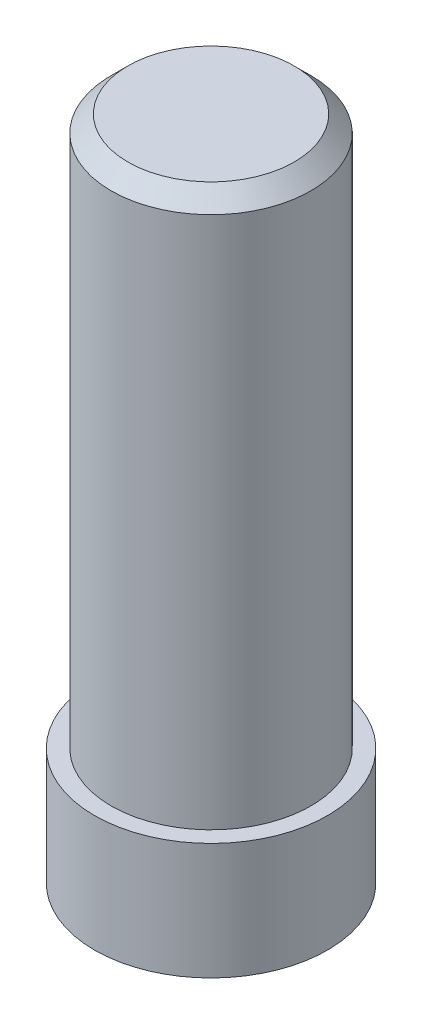
ISO-10303-21;
HEADER;
FILE_DESCRIPTION(('STEP AP214'),'2;1');
FILE_NAME('part.step','',(''),(''),'','','');
FILE_SCHEMA(('AUTOMOTIVE_DESIGN { 1 0 10303 214 1 1 1 1 }'));
ENDSEC;
DATA;
#1=APPLICATION_CONTEXT('core data for automotive mechanical design processes');
#2=APPLICATION_PROTOCOL_DEFINITION('international standard','automotive_design',2000,#1);
#3=PRODUCT_CONTEXT('',#1,'mechanical');
#4=PRODUCT('Part','Part','',(#3));
#5=PRODUCT_RELATED_PRODUCT_CATEGORY('part','',(#4));
#6=PRODUCT_DEFINITION_FORMATION('','',#4);
#7=PRODUCT_DEFINITION_CONTEXT('part definition',#1,'design');
#8=PRODUCT_DEFINITION('design','',#6,#7);
#9=PRODUCT_DEFINITION_SHAPE('','',#8);
#10=(LENGTH_UNIT() NAMED_UNIT(*) SI_UNIT(.MILLI.,.METRE.));
#11=(NAMED_UNIT(*) PLANE_ANGLE_UNIT() SI_UNIT($,.RADIAN.));
#12=(NAMED_UNIT(*) SI_UNIT($,.STERADIAN.) SOLID_ANGLE_UNIT());
#13=UNCERTAINTY_MEASURE_WITH_UNIT(LENGTH_MEASURE(1.E-05),#10,'distance_accuracy_value','');
#14=(GEOMETRIC_REPRESENTATION_CONTEXT(3) GLOBAL_UNCERTAINTY_ASSIGNED_CONTEXT((#13)) GLOBAL_UNIT_ASSIGNED_CONTEXT((#10,
#11,#12)) REPRESENTATION_CONTEXT('',''));
#15=CARTESIAN_POINT('',(0.,0.,0.));
#16=DIRECTION('',(0.,0.,1.));
#17=DIRECTION('',(1.,0.,0.));
#18=AXIS2_PLACEMENT_3D('',#15,#16,#17);
#19=CARTESIAN_POINT('',(0.,40.,0.));
#20=DIRECTION('',(0.,-1.,0.));
#21=DIRECTION('',(0.,0.,-1.));
#22=AXIS2_PLACEMENT_3D('',#19,#20,#21);
#23=CYLINDRICAL_SURFACE('',#22,6.);
#24=CARTESIAN_POINT('',(0.,7.,0.));
#25=DIRECTION('',(0.,1.,0.));
#26=DIRECTION('',(0.,0.,1.));
#27=AXIS2_PLACEMENT_3D('',#24,#25,#26);
#28=CIRCLE('',#27,6.);
#29=CARTESIAN_POINT('',(0.,7.,6.));
#30=VERTEX_POINT('',#29);
#31=EDGE_CURVE('E10',#30,#30,#28,.T.);
#32=ORIENTED_EDGE('',*,*,#31,.T.);
#33=EDGE_LOOP('',(#32));
#34=FACE_BOUND('',#33,.T.);
#35=CARTESIAN_POINT('',(0.,39.,0.));
#36=DIRECTION('',(0.,1.,0.));
#37=DIRECTION('',(0.,0.,1.));
#38=AXIS2_PLACEMENT_3D('',#35,#36,#37);
#39=CIRCLE('',#38,6.);
#40=CARTESIAN_POINT('',(0.,39.,6.));
#41=VERTEX_POINT('',#40);
#42=EDGE_CURVE('E53',#41,#41,#39,.T.);
#43=ORIENTED_EDGE('',*,*,#42,.F.);
#44=EDGE_LOOP('',(#43));
#45=FACE_BOUND('',#44,.T.);
#46=ADVANCED_FACE('F39',(#34,#45),#23,.T.);
#47=CARTESIAN_POINT('',(0.,7.,0.));
#48=DIRECTION('',(0.,-1.,0.));
#49=DIRECTION('',(0.,0.,-1.));
#50=AXIS2_PLACEMENT_3D('',#47,#48,#49);
#51=CYLINDRICAL_SURFACE('',#50,7.);
#52=CARTESIAN_POINT('',(0.,7.,0.));
#53=DIRECTION('',(0.,1.,0.));
#54=DIRECTION('',(0.,0.,1.));
#55=AXIS2_PLACEMENT_3D('',#52,#53,#54);
#56=CIRCLE('',#55,7.);
#57=CARTESIAN_POINT('',(0.,7.,7.));
#58=VERTEX_POINT('',#57);
#59=EDGE_CURVE('E47',#58,#58,#56,.T.);
#60=ORIENTED_EDGE('',*,*,#59,.F.);
#61=EDGE_LOOP('',(#60));
#62=FACE_BOUND('',#61,.T.);
#63=CARTESIAN_POINT('',(0.,0.,0.));
#64=DIRECTION('',(0.,1.,0.));
#65=DIRECTION('',(0.,0.,1.));
#66=AXIS2_PLACEMENT_3D('',#63,#64,#65);
#67=CIRCLE('',#66,7.);
#68=CARTESIAN_POINT('',(0.,0.,7.));
#69=VERTEX_POINT('',#68);
#70=EDGE_CURVE('E43',#69,#69,#67,.T.);
#71=ORIENTED_EDGE('',*,*,#70,.T.);
#72=EDGE_LOOP('',(#71));
#73=FACE_BOUND('',#72,.T.);
#74=ADVANCED_FACE('F41',(#62,#73),#51,.T.);
#75=CARTESIAN_POINT('',(0.,7.,0.));
#76=DIRECTION('',(0.,1.,0.));
#77=DIRECTION('',(0.,0.,1.));
#78=AXIS2_PLACEMENT_3D('',#75,#76,#77);
#79=PLANE('',#78);
#80=ORIENTED_EDGE('',*,*,#31,.F.);
#81=EDGE_LOOP('',(#80));
#82=FACE_BOUND('',#81,.T.);
#83=ORIENTED_EDGE('',*,*,#59,.T.);
#84=EDGE_LOOP('',(#83));
#85=FACE_BOUND('',#84,.T.);
#86=ADVANCED_FACE('F72',(#82,#85),#79,.T.);
#87=CARTESIAN_POINT('',(0.,0.,0.));
#88=DIRECTION('',(0.,1.,0.));
#89=DIRECTION('',(0.,0.,1.));
#90=AXIS2_PLACEMENT_3D('',#87,#88,#89);
#91=PLANE('',#90);
#92=ORIENTED_EDGE('',*,*,#70,.F.);
#93=EDGE_LOOP('',(#92));
#94=FACE_BOUND('',#93,.T.);
#95=ADVANCED_FACE('F64',(#94),#91,.F.);
#96=CARTESIAN_POINT('',(0.,40.,0.));
#97=DIRECTION('',(0.,-1.,0.));
#98=DIRECTION('',(0.,0.,-1.));
#99=AXIS2_PLACEMENT_3D('',#96,#97,#98);
#100=CONICAL_SURFACE('',#99,5.,0.785398163397448);
#101=ORIENTED_EDGE('',*,*,#42,.T.);
#102=EDGE_LOOP('',(#101));
#103=FACE_BOUND('',#102,.T.);
#104=CARTESIAN_POINT('',(0.,40.,0.));
#105=DIRECTION('',(0.,1.,0.));
#106=DIRECTION('',(0.,0.,1.));
#107=AXIS2_PLACEMENT_3D('',#104,#105,#106);
#108=CIRCLE('',#107,5.);
#109=CARTESIAN_POINT('',(0.,40.,5.));
#110=VERTEX_POINT('',#109);
#111=EDGE_CURVE('E56',#110,#110,#108,.T.);
#112=ORIENTED_EDGE('',*,*,#111,.F.);
#113=EDGE_LOOP('',(#112));
#114=FACE_BOUND('',#113,.T.);
#115=ADVANCED_FACE('F62',(#103,#114),#100,.T.);
#116=CARTESIAN_POINT('',(0.,40.,0.));
#117=DIRECTION('',(0.,1.,0.));
#118=DIRECTION('',(0.,0.,1.));
#119=AXIS2_PLACEMENT_3D('',#116,#117,#118);
#120=PLANE('',#119);
#121=ORIENTED_EDGE('',*,*,#111,.T.);
#122=EDGE_LOOP('',(#121));
#123=FACE_BOUND('',#122,.T.);
#124=ADVANCED_FACE('F60',(#123),#120,.T.);
#125=CLOSED_SHELL('',(#46,#74,#86,#95,#115,#124));
#126=MANIFOLD_SOLID_BREP('B2',#125);
#127=ADVANCED_BREP_SHAPE_REPRESENTATION('',(#18,#126),#14);
#128=SHAPE_DEFINITION_REPRESENTATION(#9,#127);
ENDSEC;
END-ISO-10303-21;
